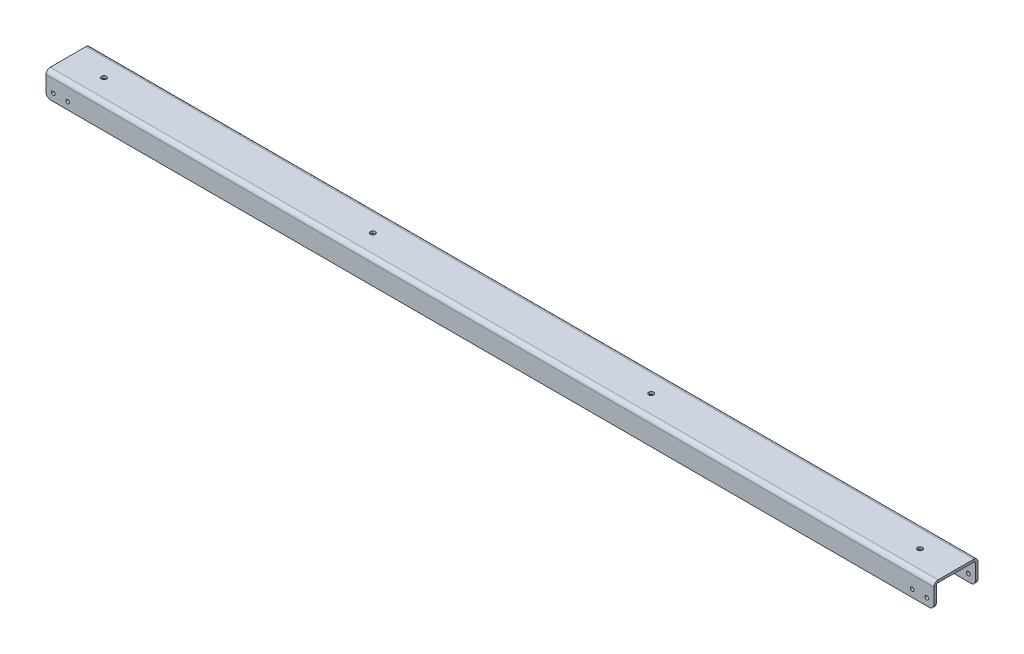
ISO-10303-21;
HEADER;
FILE_DESCRIPTION(('STEP AP214'),'2;1');
FILE_NAME('part.step','',(''),(''),'','','');
FILE_SCHEMA(('AUTOMOTIVE_DESIGN { 1 0 10303 214 1 1 1 1 }'));
ENDSEC;
DATA;
#1=APPLICATION_CONTEXT('core data for automotive mechanical design processes');
#2=APPLICATION_PROTOCOL_DEFINITION('international standard','automotive_design',2000,#1);
#3=PRODUCT_CONTEXT('',#1,'mechanical');
#4=PRODUCT('Part','Part','',(#3));
#5=PRODUCT_RELATED_PRODUCT_CATEGORY('part','',(#4));
#6=PRODUCT_DEFINITION_FORMATION('','',#4);
#7=PRODUCT_DEFINITION_CONTEXT('part definition',#1,'design');
#8=PRODUCT_DEFINITION('design','',#6,#7);
#9=PRODUCT_DEFINITION_SHAPE('','',#8);
#10=(LENGTH_UNIT() NAMED_UNIT(*) SI_UNIT(.MILLI.,.METRE.));
#11=(NAMED_UNIT(*) PLANE_ANGLE_UNIT() SI_UNIT($,.RADIAN.));
#12=(NAMED_UNIT(*) SI_UNIT($,.STERADIAN.) SOLID_ANGLE_UNIT());
#13=UNCERTAINTY_MEASURE_WITH_UNIT(LENGTH_MEASURE(1.E-05),#10,'distance_accuracy_value','');
#14=(GEOMETRIC_REPRESENTATION_CONTEXT(3) GLOBAL_UNCERTAINTY_ASSIGNED_CONTEXT((#13)) GLOBAL_UNIT_ASSIGNED_CONTEXT((#10,
#11,#12)) REPRESENTATION_CONTEXT('',''));
#15=CARTESIAN_POINT('',(0.,0.,0.));
#16=DIRECTION('',(0.,0.,1.));
#17=DIRECTION('',(1.,0.,0.));
#18=AXIS2_PLACEMENT_3D('',#15,#16,#17);
#19=CARTESIAN_POINT('',(0.,1.02619171131884E-13,-29.1719));
#20=DIRECTION('',(0.,0.,-1.));
#21=DIRECTION('',(0.,1.,0.));
#22=AXIS2_PLACEMENT_3D('',#19,#20,#21);
#23=PLANE('',#22);
#24=CARTESIAN_POINT('',(577.85,-22.3138999999999,-29.1719000000001));
#25=DIRECTION('',(0.,0.,1.));
#26=DIRECTION('',(1.,0.,0.));
#27=AXIS2_PLACEMENT_3D('',#24,#25,#26);
#28=CIRCLE('',#27,2.45744999999997);
#29=CARTESIAN_POINT('',(580.30745,-22.3138999999999,-29.1719000000001));
#30=VERTEX_POINT('',#29);
#31=EDGE_CURVE('E289',#30,#30,#28,.T.);
#32=ORIENTED_EDGE('',*,*,#31,.T.);
#33=EDGE_LOOP('',(#32));
#34=FACE_BOUND('',#33,.T.);
#35=CARTESIAN_POINT('',(558.8,-22.3138999999999,-29.1719000000001));
#36=DIRECTION('',(0.,0.,1.));
#37=DIRECTION('',(1.,0.,0.));
#38=AXIS2_PLACEMENT_3D('',#35,#36,#37);
#39=CIRCLE('',#38,2.45744999999997);
#40=CARTESIAN_POINT('',(561.25745,-22.3138999999999,-29.1719000000001));
#41=VERTEX_POINT('',#40);
#42=EDGE_CURVE('E284',#41,#41,#39,.T.);
#43=ORIENTED_EDGE('',*,*,#42,.T.);
#44=EDGE_LOOP('',(#43));
#45=FACE_BOUND('',#44,.T.);
#46=CARTESIAN_POINT('',(-558.8,-22.3138999999999,-29.1719000000001));
#47=DIRECTION('',(0.,0.,1.));
#48=DIRECTION('',(1.,0.,0.));
#49=AXIS2_PLACEMENT_3D('',#46,#47,#48);
#50=CIRCLE('',#49,2.45744999999997);
#51=CARTESIAN_POINT('',(-556.34255,-22.3138999999999,-29.1719000000001));
#52=VERTEX_POINT('',#51);
#53=EDGE_CURVE('E279',#52,#52,#50,.T.);
#54=ORIENTED_EDGE('',*,*,#53,.T.);
#55=EDGE_LOOP('',(#54));
#56=FACE_BOUND('',#55,.T.);
#57=DIRECTION('',(1.,0.,0.));
#58=VECTOR('',#57,1.);
#59=CARTESIAN_POINT('',(587.375,-31.8389,-29.1719000000001));
#60=LINE('',#59,#58);
#61=CARTESIAN_POINT('',(-581.025,-31.8389,-29.1719000000001));
#62=VERTEX_POINT('',#61);
#63=CARTESIAN_POINT('',(581.025,-31.8389,-29.1719000000001));
#64=VERTEX_POINT('',#63);
#65=EDGE_CURVE('E156',#62,#64,#60,.T.);
#66=ORIENTED_EDGE('',*,*,#65,.F.);
#67=CARTESIAN_POINT('',(-581.025,-25.4889,-29.1719000000001));
#68=DIRECTION('',(0.,0.,-1.));
#69=DIRECTION('',(0.,1.,0.));
#70=AXIS2_PLACEMENT_3D('',#67,#68,#69);
#71=CIRCLE('',#70,6.35);
#72=CARTESIAN_POINT('',(-587.375,-25.4888999999999,-29.1719000000001));
#73=VERTEX_POINT('',#72);
#74=EDGE_CURVE('E317',#62,#73,#71,.T.);
#75=ORIENTED_EDGE('',*,*,#74,.T.);
#76=DIRECTION('',(0.,-1.,0.));
#77=VECTOR('',#76,1.);
#78=CARTESIAN_POINT('',(-587.375,-31.8389,-29.1719000000001));
#79=LINE('',#78,#77);
#80=CARTESIAN_POINT('',(-587.375,-5.54989999999997,-29.1719));
#81=VERTEX_POINT('',#80);
#82=EDGE_CURVE('E179',#81,#73,#79,.T.);
#83=ORIENTED_EDGE('',*,*,#82,.F.);
#84=DIRECTION('',(1.,0.,0.));
#85=VECTOR('',#84,1.);
#86=CARTESIAN_POINT('',(0.,-5.54989999999995,-29.1719));
#87=LINE('',#86,#85);
#88=CARTESIAN_POINT('',(587.375,-5.54989999999995,-29.1719));
#89=VERTEX_POINT('',#88);
#90=EDGE_CURVE('E164',#81,#89,#87,.T.);
#91=ORIENTED_EDGE('',*,*,#90,.T.);
#92=DIRECTION('',(0.,1.,0.));
#93=VECTOR('',#92,1.);
#94=CARTESIAN_POINT('',(587.375,-3.26389999999999,-29.1719));
#95=LINE('',#94,#93);
#96=CARTESIAN_POINT('',(587.375,-25.4889,-29.1719000000001));
#97=VERTEX_POINT('',#96);
#98=EDGE_CURVE('E149',#97,#89,#95,.T.);
#99=ORIENTED_EDGE('',*,*,#98,.F.);
#100=CARTESIAN_POINT('',(581.025,-25.4889,-29.1719000000001));
#101=DIRECTION('',(0.,0.,-1.));
#102=DIRECTION('',(0.,1.,0.));
#103=AXIS2_PLACEMENT_3D('',#100,#101,#102);
#104=CIRCLE('',#103,6.35);
#105=EDGE_CURVE('E58',#97,#64,#104,.T.);
#106=ORIENTED_EDGE('',*,*,#105,.T.);
#107=EDGE_LOOP('',(#66,#75,#83,#91,#99,#106));
#108=FACE_BOUND('',#107,.T.);
#109=CARTESIAN_POINT('',(-577.85,-22.3138999999999,-29.1719000000001));
#110=DIRECTION('',(0.,0.,1.));
#111=DIRECTION('',(1.,0.,0.));
#112=AXIS2_PLACEMENT_3D('',#109,#110,#111);
#113=CIRCLE('',#112,2.45744999999997);
#114=CARTESIAN_POINT('',(-575.39255,-22.3138999999999,-29.1719000000001));
#115=VERTEX_POINT('',#114);
#116=EDGE_CURVE('E274',#115,#115,#113,.T.);
#117=ORIENTED_EDGE('',*,*,#116,.T.);
#118=EDGE_LOOP('',(#117));
#119=FACE_BOUND('',#118,.T.);
#120=ADVANCED_FACE('F38',(#34,#45,#56,#108,#119),#23,.T.);
#121=CARTESIAN_POINT('',(0.,-3.2639,0.));
#122=DIRECTION('',(0.,-1.,0.));
#123=DIRECTION('',(0.,0.,-1.));
#124=AXIS2_PLACEMENT_3D('',#121,#122,#123);
#125=PLANE('',#124);
#126=CARTESIAN_POINT('',(539.75,-3.2639,0.));
#127=DIRECTION('',(0.,-1.,0.));
#128=DIRECTION('',(0.,0.,-1.));
#129=AXIS2_PLACEMENT_3D('',#126,#127,#128);
#130=CIRCLE('',#129,3.26389999999999);
#131=CARTESIAN_POINT('',(539.75,-3.2639,-3.26389999999999));
#132=VERTEX_POINT('',#131);
#133=EDGE_CURVE('E724',#132,#132,#130,.T.);
#134=ORIENTED_EDGE('',*,*,#133,.F.);
#135=EDGE_LOOP('',(#134));
#136=FACE_BOUND('',#135,.T.);
#137=CARTESIAN_POINT('',(184.15,-3.2639,0.));
#138=DIRECTION('',(0.,-1.,0.));
#139=DIRECTION('',(0.,0.,-1.));
#140=AXIS2_PLACEMENT_3D('',#137,#138,#139);
#141=CIRCLE('',#140,3.26389999999999);
#142=CARTESIAN_POINT('',(184.15,-3.2639,-3.26389999999999));
#143=VERTEX_POINT('',#142);
#144=EDGE_CURVE('E734',#143,#143,#141,.T.);
#145=ORIENTED_EDGE('',*,*,#144,.F.);
#146=EDGE_LOOP('',(#145));
#147=FACE_BOUND('',#146,.T.);
#148=CARTESIAN_POINT('',(-184.15,-3.2639,0.));
#149=DIRECTION('',(0.,-1.,0.));
#150=DIRECTION('',(0.,0.,-1.));
#151=AXIS2_PLACEMENT_3D('',#148,#149,#150);
#152=CIRCLE('',#151,3.26389999999999);
#153=CARTESIAN_POINT('',(-184.15,-3.2639,-3.26389999999999));
#154=VERTEX_POINT('',#153);
#155=EDGE_CURVE('E740',#154,#154,#152,.T.);
#156=ORIENTED_EDGE('',*,*,#155,.F.);
#157=EDGE_LOOP('',(#156));
#158=FACE_BOUND('',#157,.T.);
#159=CARTESIAN_POINT('',(-539.75,-3.2639,0.));
#160=DIRECTION('',(0.,-1.,0.));
#161=DIRECTION('',(0.,0.,-1.));
#162=AXIS2_PLACEMENT_3D('',#159,#160,#161);
#163=CIRCLE('',#162,3.26389999999999);
#164=CARTESIAN_POINT('',(-539.75,-3.2639,-3.26389999999999));
#165=VERTEX_POINT('',#164);
#166=EDGE_CURVE('E746',#165,#165,#163,.T.);
#167=ORIENTED_EDGE('',*,*,#166,.F.);
#168=EDGE_LOOP('',(#167));
#169=FACE_BOUND('',#168,.T.);
#170=DIRECTION('',(0.,0.,1.));
#171=VECTOR('',#170,1.);
#172=CARTESIAN_POINT('',(-587.375,-3.2639,25.908));
#173=LINE('',#172,#171);
#174=CARTESIAN_POINT('',(-587.375,-3.26389999999999,-23.622));
#175=VERTEX_POINT('',#174);
#176=CARTESIAN_POINT('',(-587.375,-3.2639,23.622));
#177=VERTEX_POINT('',#176);
#178=EDGE_CURVE('E263',#175,#177,#173,.T.);
#179=ORIENTED_EDGE('',*,*,#178,.F.);
#180=DIRECTION('',(1.,0.,0.));
#181=VECTOR('',#180,1.);
#182=CARTESIAN_POINT('',(587.375,-3.26389999999999,-23.622));
#183=LINE('',#182,#181);
#184=CARTESIAN_POINT('',(587.375,-3.26389999999999,-23.622));
#185=VERTEX_POINT('',#184);
#186=EDGE_CURVE('E200',#185,#175,#183,.F.);
#187=ORIENTED_EDGE('',*,*,#186,.F.);
#188=DIRECTION('',(0.,0.,-1.));
#189=VECTOR('',#188,1.);
#190=CARTESIAN_POINT('',(587.375,-3.2639,25.908));
#191=LINE('',#190,#189);
#192=CARTESIAN_POINT('',(587.375,-3.2639,23.622));
#193=VERTEX_POINT('',#192);
#194=EDGE_CURVE('E260',#193,#185,#191,.T.);
#195=ORIENTED_EDGE('',*,*,#194,.F.);
#196=DIRECTION('',(-1.,0.,0.));
#197=VECTOR('',#196,1.);
#198=CARTESIAN_POINT('',(-587.375,-3.26390000000001,23.622));
#199=LINE('',#198,#197);
#200=EDGE_CURVE('E250',#177,#193,#199,.F.);
#201=ORIENTED_EDGE('',*,*,#200,.F.);
#202=EDGE_LOOP('',(#179,#187,#195,#201));
#203=FACE_BOUND('',#202,.T.);
#204=ADVANCED_FACE('F383',(#136,#147,#158,#169,#203),#125,.T.);
#205=CARTESIAN_POINT('',(0.,0.,0.));
#206=DIRECTION('',(0.,-1.,0.));
#207=DIRECTION('',(0.,0.,-1.));
#208=AXIS2_PLACEMENT_3D('',#205,#206,#207);
#209=PLANE('',#208);
#210=CARTESIAN_POINT('',(539.75,0.,0.));
#211=DIRECTION('',(0.,1.,0.));
#212=DIRECTION('',(0.,0.,1.));
#213=AXIS2_PLACEMENT_3D('',#210,#211,#212);
#214=CIRCLE('',#213,3.26389999999999);
#215=CARTESIAN_POINT('',(539.75,0.,3.26389999999999));
#216=VERTEX_POINT('',#215);
#217=EDGE_CURVE('E727',#216,#216,#214,.T.);
#218=ORIENTED_EDGE('',*,*,#217,.F.);
#219=EDGE_LOOP('',(#218));
#220=FACE_BOUND('',#219,.T.);
#221=CARTESIAN_POINT('',(184.15,0.,0.));
#222=DIRECTION('',(0.,1.,0.));
#223=DIRECTION('',(0.,0.,1.));
#224=AXIS2_PLACEMENT_3D('',#221,#222,#223);
#225=CIRCLE('',#224,3.26389999999999);
#226=CARTESIAN_POINT('',(184.15,0.,3.26389999999999));
#227=VERTEX_POINT('',#226);
#228=EDGE_CURVE('E729',#227,#227,#225,.T.);
#229=ORIENTED_EDGE('',*,*,#228,.F.);
#230=EDGE_LOOP('',(#229));
#231=FACE_BOUND('',#230,.T.);
#232=CARTESIAN_POINT('',(-184.15,0.,0.));
#233=DIRECTION('',(0.,1.,0.));
#234=DIRECTION('',(0.,0.,1.));
#235=AXIS2_PLACEMENT_3D('',#232,#233,#234);
#236=CIRCLE('',#235,3.26389999999999);
#237=CARTESIAN_POINT('',(-184.15,0.,3.26389999999999));
#238=VERTEX_POINT('',#237);
#239=EDGE_CURVE('E737',#238,#238,#236,.T.);
#240=ORIENTED_EDGE('',*,*,#239,.F.);
#241=EDGE_LOOP('',(#240));
#242=FACE_BOUND('',#241,.T.);
#243=CARTESIAN_POINT('',(-539.75,0.,0.));
#244=DIRECTION('',(0.,1.,0.));
#245=DIRECTION('',(0.,0.,1.));
#246=AXIS2_PLACEMENT_3D('',#243,#244,#245);
#247=CIRCLE('',#246,3.26389999999999);
#248=CARTESIAN_POINT('',(-539.75,0.,3.26389999999999));
#249=VERTEX_POINT('',#248);
#250=EDGE_CURVE('E743',#249,#249,#247,.T.);
#251=ORIENTED_EDGE('',*,*,#250,.F.);
#252=EDGE_LOOP('',(#251));
#253=FACE_BOUND('',#252,.T.);
#254=DIRECTION('',(1.,0.,0.));
#255=VECTOR('',#254,1.);
#256=CARTESIAN_POINT('',(587.375,0.,-23.622));
#257=LINE('',#256,#255);
#258=CARTESIAN_POINT('',(587.375,0.,-23.622));
#259=VERTEX_POINT('',#258);
#260=CARTESIAN_POINT('',(-587.375,0.,-23.622));
#261=VERTEX_POINT('',#260);
#262=EDGE_CURVE('E166',#259,#261,#257,.F.);
#263=ORIENTED_EDGE('',*,*,#262,.T.);
#264=DIRECTION('',(0.,0.,1.));
#265=VECTOR('',#264,1.);
#266=CARTESIAN_POINT('',(-587.375,0.,25.908));
#267=LINE('',#266,#265);
#268=CARTESIAN_POINT('',(-587.375,0.,23.622));
#269=VERTEX_POINT('',#268);
#270=EDGE_CURVE('E264',#261,#269,#267,.T.);
#271=ORIENTED_EDGE('',*,*,#270,.T.);
#272=DIRECTION('',(-1.,0.,0.));
#273=VECTOR('',#272,1.);
#274=CARTESIAN_POINT('',(-587.375,0.,23.622));
#275=LINE('',#274,#273);
#276=CARTESIAN_POINT('',(587.375,0.,23.622));
#277=VERTEX_POINT('',#276);
#278=EDGE_CURVE('E238',#269,#277,#275,.F.);
#279=ORIENTED_EDGE('',*,*,#278,.T.);
#280=DIRECTION('',(0.,0.,-1.));
#281=VECTOR('',#280,1.);
#282=CARTESIAN_POINT('',(587.375,0.,25.908));
#283=LINE('',#282,#281);
#284=EDGE_CURVE('E258',#277,#259,#283,.T.);
#285=ORIENTED_EDGE('',*,*,#284,.T.);
#286=EDGE_LOOP('',(#263,#271,#279,#285));
#287=FACE_BOUND('',#286,.T.);
#288=ADVANCED_FACE('F352',(#220,#231,#242,#253,#287),#209,.F.);
#289=CARTESIAN_POINT('',(587.375,-3.2639,25.908));
#290=DIRECTION('',(1.,0.,0.));
#291=DIRECTION('',(0.,0.,-1.));
#292=AXIS2_PLACEMENT_3D('',#289,#290,#291);
#293=PLANE('',#292);
#294=ORIENTED_EDGE('',*,*,#194,.T.);
#295=DIRECTION('',(0.,1.,0.));
#296=VECTOR('',#295,1.);
#297=CARTESIAN_POINT('',(587.375,-3.26389999999999,-23.622));
#298=LINE('',#297,#296);
#299=EDGE_CURVE('E196',#185,#259,#298,.T.);
#300=ORIENTED_EDGE('',*,*,#299,.T.);
#301=ORIENTED_EDGE('',*,*,#284,.F.);
#302=DIRECTION('',(0.,1.,0.));
#303=VECTOR('',#302,1.);
#304=CARTESIAN_POINT('',(587.375,-3.26390000000001,23.622));
#305=LINE('',#304,#303);
#306=EDGE_CURVE('E255',#193,#277,#305,.T.);
#307=ORIENTED_EDGE('',*,*,#306,.F.);
#308=EDGE_LOOP('',(#294,#300,#301,#307));
#309=FACE_BOUND('',#308,.T.);
#310=ADVANCED_FACE('F355',(#309),#293,.T.);
#311=CARTESIAN_POINT('',(-587.375,-3.2639,25.908));
#312=DIRECTION('',(-1.,0.,0.));
#313=DIRECTION('',(0.,0.,1.));
#314=AXIS2_PLACEMENT_3D('',#311,#312,#313);
#315=PLANE('',#314);
#316=DIRECTION('',(0.,1.,0.));
#317=VECTOR('',#316,1.);
#318=CARTESIAN_POINT('',(-587.375,-3.26389999999999,-23.622));
#319=LINE('',#318,#317);
#320=EDGE_CURVE('E204',#175,#261,#319,.T.);
#321=ORIENTED_EDGE('',*,*,#320,.F.);
#322=ORIENTED_EDGE('',*,*,#178,.T.);
#323=DIRECTION('',(0.,1.,0.));
#324=VECTOR('',#323,1.);
#325=CARTESIAN_POINT('',(-587.375,-3.26390000000001,23.622));
#326=LINE('',#325,#324);
#327=EDGE_CURVE('E244',#177,#269,#326,.T.);
#328=ORIENTED_EDGE('',*,*,#327,.T.);
#329=ORIENTED_EDGE('',*,*,#270,.F.);
#330=EDGE_LOOP('',(#321,#322,#328,#329));
#331=FACE_BOUND('',#330,.T.);
#332=ADVANCED_FACE('F442',(#331),#315,.T.);
#333=CARTESIAN_POINT('',(587.375,-5.54990000000001,23.622));
#334=DIRECTION('',(1.,0.,0.));
#335=DIRECTION('',(0.,0.,-1.));
#336=AXIS2_PLACEMENT_3D('',#333,#334,#335);
#337=PLANE('',#336);
#338=DIRECTION('',(0.,0.,1.));
#339=VECTOR('',#338,1.);
#340=CARTESIAN_POINT('',(587.375,-5.54989999999999,25.908));
#341=LINE('',#340,#339);
#342=CARTESIAN_POINT('',(587.375,-5.5499,25.908));
#343=VERTEX_POINT('',#342);
#344=CARTESIAN_POINT('',(587.375,-5.54989999999999,29.1719));
#345=VERTEX_POINT('',#344);
#346=EDGE_CURVE('E207',#343,#345,#341,.T.);
#347=ORIENTED_EDGE('',*,*,#346,.F.);
#348=CARTESIAN_POINT('',(587.375,-5.54990000000001,23.622));
#349=DIRECTION('',(-1.,0.,0.));
#350=DIRECTION('',(0.,0.,1.));
#351=AXIS2_PLACEMENT_3D('',#348,#349,#350);
#352=CIRCLE('',#351,2.286);
#353=EDGE_CURVE('E247',#193,#343,#352,.F.);
#354=ORIENTED_EDGE('',*,*,#353,.F.);
#355=ORIENTED_EDGE('',*,*,#306,.T.);
#356=CARTESIAN_POINT('',(587.375,-5.54990000000001,23.622));
#357=DIRECTION('',(-1.,0.,0.));
#358=DIRECTION('',(0.,0.,1.));
#359=AXIS2_PLACEMENT_3D('',#356,#357,#358);
#360=CIRCLE('',#359,5.5499);
#361=EDGE_CURVE('E240',#277,#345,#360,.F.);
#362=ORIENTED_EDGE('',*,*,#361,.T.);
#363=EDGE_LOOP('',(#347,#354,#355,#362));
#364=FACE_BOUND('',#363,.T.);
#365=ADVANCED_FACE('F358',(#364),#337,.T.);
#366=CARTESIAN_POINT('',(-587.375,-5.54990000000001,23.622));
#367=DIRECTION('',(1.,0.,0.));
#368=DIRECTION('',(0.,0.,-1.));
#369=AXIS2_PLACEMENT_3D('',#366,#367,#368);
#370=PLANE('',#369);
#371=CARTESIAN_POINT('',(-587.375,-5.54990000000001,23.622));
#372=DIRECTION('',(-1.,0.,0.));
#373=DIRECTION('',(0.,0.,1.));
#374=AXIS2_PLACEMENT_3D('',#371,#372,#373);
#375=CIRCLE('',#374,2.286);
#376=CARTESIAN_POINT('',(-587.375,-5.5499,25.908));
#377=VERTEX_POINT('',#376);
#378=EDGE_CURVE('E231',#377,#177,#375,.T.);
#379=ORIENTED_EDGE('',*,*,#378,.F.);
#380=DIRECTION('',(0.,0.,1.));
#381=VECTOR('',#380,1.);
#382=CARTESIAN_POINT('',(-587.375,-5.54990000000003,25.908));
#383=LINE('',#382,#381);
#384=CARTESIAN_POINT('',(-587.375,-5.54990000000001,29.1719));
#385=VERTEX_POINT('',#384);
#386=EDGE_CURVE('E213',#377,#385,#383,.T.);
#387=ORIENTED_EDGE('',*,*,#386,.T.);
#388=CARTESIAN_POINT('',(-587.375,-5.54990000000001,23.622));
#389=DIRECTION('',(-1.,0.,0.));
#390=DIRECTION('',(0.,0.,1.));
#391=AXIS2_PLACEMENT_3D('',#388,#389,#390);
#392=CIRCLE('',#391,5.5499);
#393=EDGE_CURVE('E241',#385,#269,#392,.T.);
#394=ORIENTED_EDGE('',*,*,#393,.T.);
#395=ORIENTED_EDGE('',*,*,#327,.F.);
#396=EDGE_LOOP('',(#379,#387,#394,#395));
#397=FACE_BOUND('',#396,.T.);
#398=ADVANCED_FACE('F338',(#397),#370,.F.);
#399=CARTESIAN_POINT('',(-587.375,-5.54990000000001,23.622));
#400=DIRECTION('',(-1.,0.,0.));
#401=DIRECTION('',(0.,0.,1.));
#402=AXIS2_PLACEMENT_3D('',#399,#400,#401);
#403=CYLINDRICAL_SURFACE('',#402,5.5499);
#404=ORIENTED_EDGE('',*,*,#278,.F.);
#405=ORIENTED_EDGE('',*,*,#393,.F.);
#406=DIRECTION('',(-1.,0.,0.));
#407=VECTOR('',#406,1.);
#408=CARTESIAN_POINT('',(0.,-5.54990000000001,29.1719));
#409=LINE('',#408,#407);
#410=EDGE_CURVE('E216',#345,#385,#409,.T.);
#411=ORIENTED_EDGE('',*,*,#410,.F.);
#412=ORIENTED_EDGE('',*,*,#361,.F.);
#413=EDGE_LOOP('',(#404,#405,#411,#412));
#414=FACE_BOUND('',#413,.T.);
#415=ADVANCED_FACE('F348',(#414),#403,.T.);
#416=CARTESIAN_POINT('',(-587.375,-5.54990000000001,23.622));
#417=DIRECTION('',(-1.,0.,0.));
#418=DIRECTION('',(0.,0.,1.));
#419=AXIS2_PLACEMENT_3D('',#416,#417,#418);
#420=CYLINDRICAL_SURFACE('',#419,2.286);
#421=ORIENTED_EDGE('',*,*,#200,.T.);
#422=ORIENTED_EDGE('',*,*,#353,.T.);
#423=DIRECTION('',(-1.,0.,0.));
#424=VECTOR('',#423,1.);
#425=CARTESIAN_POINT('',(587.375,-5.54989999999999,25.908));
#426=LINE('',#425,#424);
#427=EDGE_CURVE('E210',#343,#377,#426,.T.);
#428=ORIENTED_EDGE('',*,*,#427,.T.);
#429=ORIENTED_EDGE('',*,*,#378,.T.);
#430=EDGE_LOOP('',(#421,#422,#428,#429));
#431=FACE_BOUND('',#430,.T.);
#432=ADVANCED_FACE('F333',(#431),#420,.F.);
#433=CARTESIAN_POINT('',(-587.375,-3.26389999999999,29.1719));
#434=DIRECTION('',(-1.,0.,0.));
#435=DIRECTION('',(0.,-1.,0.));
#436=AXIS2_PLACEMENT_3D('',#433,#434,#435);
#437=PLANE('',#436);
#438=DIRECTION('',(0.,1.,0.));
#439=VECTOR('',#438,1.);
#440=CARTESIAN_POINT('',(-587.375,-3.2639,25.908));
#441=LINE('',#440,#439);
#442=CARTESIAN_POINT('',(-587.375,-25.4888999999999,25.9080000000001));
#443=VERTEX_POINT('',#442);
#444=EDGE_CURVE('E226',#443,#377,#441,.T.);
#445=ORIENTED_EDGE('',*,*,#444,.F.);
#446=DIRECTION('',(0.,0.,-1.));
#447=VECTOR('',#446,1.);
#448=CARTESIAN_POINT('',(-587.375,-25.4888999999999,29.1719000000001));
#449=LINE('',#448,#447);
#450=CARTESIAN_POINT('',(-587.375,-25.4888999999999,29.1719000000001));
#451=VERTEX_POINT('',#450);
#452=EDGE_CURVE('E298',#443,#451,#449,.F.);
#453=ORIENTED_EDGE('',*,*,#452,.T.);
#454=DIRECTION('',(0.,1.,0.));
#455=VECTOR('',#454,1.);
#456=CARTESIAN_POINT('',(-587.375,-3.26389999999999,29.1719));
#457=LINE('',#456,#455);
#458=EDGE_CURVE('E229',#451,#385,#457,.T.);
#459=ORIENTED_EDGE('',*,*,#458,.T.);
#460=ORIENTED_EDGE('',*,*,#386,.F.);
#461=EDGE_LOOP('',(#445,#453,#459,#460));
#462=FACE_BOUND('',#461,.T.);
#463=ADVANCED_FACE('F340',(#462),#437,.T.);
#464=CARTESIAN_POINT('',(587.375,-31.8389,29.1719000000001));
#465=DIRECTION('',(1.,0.,0.));
#466=DIRECTION('',(0.,1.,0.));
#467=AXIS2_PLACEMENT_3D('',#464,#465,#466);
#468=PLANE('',#467);
#469=DIRECTION('',(0.,-1.,0.));
#470=VECTOR('',#469,1.);
#471=CARTESIAN_POINT('',(587.375,-31.8389,29.1719000000001));
#472=LINE('',#471,#470);
#473=CARTESIAN_POINT('',(587.375,-25.4889,29.1719000000001));
#474=VERTEX_POINT('',#473);
#475=EDGE_CURVE('E222',#345,#474,#472,.T.);
#476=ORIENTED_EDGE('',*,*,#475,.T.);
#477=DIRECTION('',(0.,0.,-1.));
#478=VECTOR('',#477,1.);
#479=CARTESIAN_POINT('',(587.375,-25.4889,29.1719000000001));
#480=LINE('',#479,#478);
#481=CARTESIAN_POINT('',(587.375,-25.4889000000001,25.9080000000001));
#482=VERTEX_POINT('',#481);
#483=EDGE_CURVE('E46',#474,#482,#480,.T.);
#484=ORIENTED_EDGE('',*,*,#483,.T.);
#485=DIRECTION('',(0.,-1.,0.));
#486=VECTOR('',#485,1.);
#487=CARTESIAN_POINT('',(587.375,-31.8389,25.9080000000001));
#488=LINE('',#487,#486);
#489=EDGE_CURVE('E221',#343,#482,#488,.T.);
#490=ORIENTED_EDGE('',*,*,#489,.F.);
#491=ORIENTED_EDGE('',*,*,#346,.T.);
#492=EDGE_LOOP('',(#476,#484,#490,#491));
#493=FACE_BOUND('',#492,.T.);
#494=ADVANCED_FACE('F322',(#493),#468,.T.);
#495=CARTESIAN_POINT('',(0.,1.02619171131884E-13,29.1719));
#496=DIRECTION('',(0.,0.,1.));
#497=DIRECTION('',(0.,-1.,0.));
#498=AXIS2_PLACEMENT_3D('',#495,#496,#497);
#499=PLANE('',#498);
#500=CARTESIAN_POINT('',(577.85,-22.3138999999999,29.1719));
#501=DIRECTION('',(0.,0.,1.));
#502=DIRECTION('',(1.,0.,0.));
#503=AXIS2_PLACEMENT_3D('',#500,#501,#502);
#504=CIRCLE('',#503,2.45744999999997);
#505=CARTESIAN_POINT('',(580.30745,-22.3138999999999,29.1719));
#506=VERTEX_POINT('',#505);
#507=EDGE_CURVE('E749',#506,#506,#504,.T.);
#508=ORIENTED_EDGE('',*,*,#507,.F.);
#509=EDGE_LOOP('',(#508));
#510=FACE_BOUND('',#509,.T.);
#511=CARTESIAN_POINT('',(558.8,-22.3138999999999,29.1719));
#512=DIRECTION('',(0.,0.,1.));
#513=DIRECTION('',(1.,0.,0.));
#514=AXIS2_PLACEMENT_3D('',#511,#512,#513);
#515=CIRCLE('',#514,2.45744999999997);
#516=CARTESIAN_POINT('',(561.25745,-22.3138999999999,29.1719));
#517=VERTEX_POINT('',#516);
#518=EDGE_CURVE('E755',#517,#517,#515,.T.);
#519=ORIENTED_EDGE('',*,*,#518,.F.);
#520=EDGE_LOOP('',(#519));
#521=FACE_BOUND('',#520,.T.);
#522=CARTESIAN_POINT('',(-558.8,-22.3138999999999,29.1719));
#523=DIRECTION('',(0.,0.,1.));
#524=DIRECTION('',(1.,0.,0.));
#525=AXIS2_PLACEMENT_3D('',#522,#523,#524);
#526=CIRCLE('',#525,2.45744999999997);
#527=CARTESIAN_POINT('',(-556.34255,-22.3138999999999,29.1719));
#528=VERTEX_POINT('',#527);
#529=EDGE_CURVE('E762',#528,#528,#526,.T.);
#530=ORIENTED_EDGE('',*,*,#529,.F.);
#531=EDGE_LOOP('',(#530));
#532=FACE_BOUND('',#531,.T.);
#533=CARTESIAN_POINT('',(-577.85,-22.3138999999999,29.1719));
#534=DIRECTION('',(0.,0.,1.));
#535=DIRECTION('',(1.,0.,0.));
#536=AXIS2_PLACEMENT_3D('',#533,#534,#535);
#537=CIRCLE('',#536,2.45744999999997);
#538=CARTESIAN_POINT('',(-575.39255,-22.3138999999999,29.1719));
#539=VERTEX_POINT('',#538);
#540=EDGE_CURVE('E769',#539,#539,#537,.T.);
#541=ORIENTED_EDGE('',*,*,#540,.F.);
#542=EDGE_LOOP('',(#541));
#543=FACE_BOUND('',#542,.T.);
#544=ORIENTED_EDGE('',*,*,#458,.F.);
#545=CARTESIAN_POINT('',(-581.025,-25.4889,29.1719000000001));
#546=DIRECTION('',(0.,0.,1.));
#547=DIRECTION('',(0.,-1.,0.));
#548=AXIS2_PLACEMENT_3D('',#545,#546,#547);
#549=CIRCLE('',#548,6.35);
#550=CARTESIAN_POINT('',(-581.025,-31.8389,29.1719000000001));
#551=VERTEX_POINT('',#550);
#552=EDGE_CURVE('E302',#451,#551,#549,.T.);
#553=ORIENTED_EDGE('',*,*,#552,.T.);
#554=DIRECTION('',(-1.,0.,0.));
#555=VECTOR('',#554,1.);
#556=CARTESIAN_POINT('',(-587.375,-31.8389,29.1719000000001));
#557=LINE('',#556,#555);
#558=CARTESIAN_POINT('',(581.025,-31.8389,29.1719000000001));
#559=VERTEX_POINT('',#558);
#560=EDGE_CURVE('E225',#559,#551,#557,.T.);
#561=ORIENTED_EDGE('',*,*,#560,.F.);
#562=CARTESIAN_POINT('',(581.025,-25.4889,29.1719000000001));
#563=DIRECTION('',(0.,0.,1.));
#564=DIRECTION('',(0.,-1.,0.));
#565=AXIS2_PLACEMENT_3D('',#562,#563,#564);
#566=CIRCLE('',#565,6.35);
#567=EDGE_CURVE('E300',#559,#474,#566,.T.);
#568=ORIENTED_EDGE('',*,*,#567,.T.);
#569=ORIENTED_EDGE('',*,*,#475,.F.);
#570=ORIENTED_EDGE('',*,*,#410,.T.);
#571=EDGE_LOOP('',(#544,#553,#561,#568,#569,#570));
#572=FACE_BOUND('',#571,.T.);
#573=ADVANCED_FACE('F359',(#510,#521,#532,#543,#572),#499,.T.);
#574=CARTESIAN_POINT('',(0.,0.,25.908));
#575=DIRECTION('',(0.,0.,1.));
#576=DIRECTION('',(0.,-1.,0.));
#577=AXIS2_PLACEMENT_3D('',#574,#575,#576);
#578=PLANE('',#577);
#579=CARTESIAN_POINT('',(577.85,-22.3138999999999,25.9080000000001));
#580=DIRECTION('',(0.,0.,1.));
#581=DIRECTION('',(0.,-1.,0.));
#582=AXIS2_PLACEMENT_3D('',#579,#580,#581);
#583=CIRCLE('',#582,2.45744999999997);
#584=CARTESIAN_POINT('',(577.85,-24.7713499999999,25.9080000000001));
#585=VERTEX_POINT('',#584);
#586=EDGE_CURVE('E288',#585,#585,#583,.T.);
#587=ORIENTED_EDGE('',*,*,#586,.T.);
#588=EDGE_LOOP('',(#587));
#589=FACE_BOUND('',#588,.T.);
#590=CARTESIAN_POINT('',(558.8,-22.3138999999999,25.9080000000001));
#591=DIRECTION('',(0.,0.,1.));
#592=DIRECTION('',(0.,-1.,0.));
#593=AXIS2_PLACEMENT_3D('',#590,#591,#592);
#594=CIRCLE('',#593,2.45744999999997);
#595=CARTESIAN_POINT('',(558.8,-24.7713499999999,25.9080000000001));
#596=VERTEX_POINT('',#595);
#597=EDGE_CURVE('E280',#596,#596,#594,.T.);
#598=ORIENTED_EDGE('',*,*,#597,.T.);
#599=EDGE_LOOP('',(#598));
#600=FACE_BOUND('',#599,.T.);
#601=CARTESIAN_POINT('',(-558.8,-22.3138999999999,25.9080000000001));
#602=DIRECTION('',(0.,0.,1.));
#603=DIRECTION('',(0.,-1.,0.));
#604=AXIS2_PLACEMENT_3D('',#601,#602,#603);
#605=CIRCLE('',#604,2.45744999999997);
#606=CARTESIAN_POINT('',(-558.8,-24.7713499999999,25.9080000000001));
#607=VERTEX_POINT('',#606);
#608=EDGE_CURVE('E275',#607,#607,#605,.T.);
#609=ORIENTED_EDGE('',*,*,#608,.T.);
#610=EDGE_LOOP('',(#609));
#611=FACE_BOUND('',#610,.T.);
#612=CARTESIAN_POINT('',(-577.85,-22.3138999999999,25.9080000000001));
#613=DIRECTION('',(0.,0.,1.));
#614=DIRECTION('',(0.,-1.,0.));
#615=AXIS2_PLACEMENT_3D('',#612,#613,#614);
#616=CIRCLE('',#615,2.45744999999997);
#617=CARTESIAN_POINT('',(-577.85,-24.7713499999999,25.9080000000001));
#618=VERTEX_POINT('',#617);
#619=EDGE_CURVE('E273',#618,#618,#616,.T.);
#620=ORIENTED_EDGE('',*,*,#619,.T.);
#621=EDGE_LOOP('',(#620));
#622=FACE_BOUND('',#621,.T.);
#623=DIRECTION('',(-1.,0.,0.));
#624=VECTOR('',#623,1.);
#625=CARTESIAN_POINT('',(-587.375,-31.8389,25.9080000000001));
#626=LINE('',#625,#624);
#627=CARTESIAN_POINT('',(581.025,-31.8389,25.9080000000001));
#628=VERTEX_POINT('',#627);
#629=CARTESIAN_POINT('',(-581.025,-31.8389,25.9080000000001));
#630=VERTEX_POINT('',#629);
#631=EDGE_CURVE('E234',#628,#630,#626,.T.);
#632=ORIENTED_EDGE('',*,*,#631,.T.);
#633=CARTESIAN_POINT('',(-581.025,-25.4889,25.9080000000001));
#634=DIRECTION('',(0.,0.,1.));
#635=DIRECTION('',(0.,-1.,0.));
#636=AXIS2_PLACEMENT_3D('',#633,#634,#635);
#637=CIRCLE('',#636,6.35);
#638=EDGE_CURVE('E296',#630,#443,#637,.F.);
#639=ORIENTED_EDGE('',*,*,#638,.T.);
#640=ORIENTED_EDGE('',*,*,#444,.T.);
#641=ORIENTED_EDGE('',*,*,#427,.F.);
#642=ORIENTED_EDGE('',*,*,#489,.T.);
#643=CARTESIAN_POINT('',(581.025,-25.4889,25.9080000000001));
#644=DIRECTION('',(0.,0.,1.));
#645=DIRECTION('',(0.,-1.,0.));
#646=AXIS2_PLACEMENT_3D('',#643,#644,#645);
#647=CIRCLE('',#646,6.35);
#648=EDGE_CURVE('E294',#482,#628,#647,.F.);
#649=ORIENTED_EDGE('',*,*,#648,.T.);
#650=EDGE_LOOP('',(#632,#639,#640,#641,#642,#649));
#651=FACE_BOUND('',#650,.T.);
#652=ADVANCED_FACE('F328',(#589,#600,#611,#622,#651),#578,.F.);
#653=CARTESIAN_POINT('',(-587.375,-31.8389,29.1719000000001));
#654=DIRECTION('',(0.,-1.,0.));
#655=DIRECTION('',(0.,0.,-1.));
#656=AXIS2_PLACEMENT_3D('',#653,#654,#655);
#657=PLANE('',#656);
#658=ORIENTED_EDGE('',*,*,#560,.T.);
#659=DIRECTION('',(0.,0.,-1.));
#660=VECTOR('',#659,1.);
#661=CARTESIAN_POINT('',(-581.025,-31.8389,29.1719000000001));
#662=LINE('',#661,#660);
#663=EDGE_CURVE('E291',#551,#630,#662,.T.);
#664=ORIENTED_EDGE('',*,*,#663,.T.);
#665=ORIENTED_EDGE('',*,*,#631,.F.);
#666=DIRECTION('',(0.,0.,-1.));
#667=VECTOR('',#666,1.);
#668=CARTESIAN_POINT('',(581.025,-31.8389,29.1719000000001));
#669=LINE('',#668,#667);
#670=EDGE_CURVE('E266',#628,#559,#669,.F.);
#671=ORIENTED_EDGE('',*,*,#670,.T.);
#672=EDGE_LOOP('',(#658,#664,#665,#671));
#673=FACE_BOUND('',#672,.T.);
#674=ADVANCED_FACE('F364',(#673),#657,.T.);
#675=CARTESIAN_POINT('',(-587.375,-5.54989999999999,-23.622));
#676=DIRECTION('',(-1.,0.,0.));
#677=DIRECTION('',(0.,0.,1.));
#678=AXIS2_PLACEMENT_3D('',#675,#676,#677);
#679=PLANE('',#678);
#680=DIRECTION('',(0.,0.,-1.));
#681=VECTOR('',#680,1.);
#682=CARTESIAN_POINT('',(-587.375,-5.54989999999999,-25.908));
#683=LINE('',#682,#681);
#684=CARTESIAN_POINT('',(-587.375,-5.54989999999998,-25.908));
#685=VERTEX_POINT('',#684);
#686=EDGE_CURVE('E187',#685,#81,#683,.T.);
#687=ORIENTED_EDGE('',*,*,#686,.F.);
#688=CARTESIAN_POINT('',(-587.375,-5.54989999999999,-23.622));
#689=DIRECTION('',(1.,0.,0.));
#690=DIRECTION('',(0.,0.,-1.));
#691=AXIS2_PLACEMENT_3D('',#688,#689,#690);
#692=CIRCLE('',#691,2.286);
#693=EDGE_CURVE('E169',#175,#685,#692,.F.);
#694=ORIENTED_EDGE('',*,*,#693,.F.);
#695=ORIENTED_EDGE('',*,*,#320,.T.);
#696=CARTESIAN_POINT('',(-587.375,-5.54989999999999,-23.622));
#697=DIRECTION('',(1.,0.,0.));
#698=DIRECTION('',(0.,0.,-1.));
#699=AXIS2_PLACEMENT_3D('',#696,#697,#698);
#700=CIRCLE('',#699,5.5499);
#701=EDGE_CURVE('E195',#261,#81,#700,.F.);
#702=ORIENTED_EDGE('',*,*,#701,.T.);
#703=EDGE_LOOP('',(#687,#694,#695,#702));
#704=FACE_BOUND('',#703,.T.);
#705=ADVANCED_FACE('F418',(#704),#679,.T.);
#706=CARTESIAN_POINT('',(587.375,-5.54989999999999,-23.622));
#707=DIRECTION('',(-1.,0.,0.));
#708=DIRECTION('',(0.,0.,1.));
#709=AXIS2_PLACEMENT_3D('',#706,#707,#708);
#710=PLANE('',#709);
#711=CARTESIAN_POINT('',(587.375,-5.54989999999999,-23.622));
#712=DIRECTION('',(1.,0.,0.));
#713=DIRECTION('',(0.,0.,-1.));
#714=AXIS2_PLACEMENT_3D('',#711,#712,#713);
#715=CIRCLE('',#714,2.286);
#716=CARTESIAN_POINT('',(587.375,-5.54989999999998,-25.908));
#717=VERTEX_POINT('',#716);
#718=EDGE_CURVE('E155',#717,#185,#715,.T.);
#719=ORIENTED_EDGE('',*,*,#718,.F.);
#720=DIRECTION('',(0.,0.,-1.));
#721=VECTOR('',#720,1.);
#722=CARTESIAN_POINT('',(587.375,-5.54989999999996,-25.908));
#723=LINE('',#722,#721);
#724=EDGE_CURVE('E153',#717,#89,#723,.T.);
#725=ORIENTED_EDGE('',*,*,#724,.T.);
#726=CARTESIAN_POINT('',(587.375,-5.54989999999999,-23.622));
#727=DIRECTION('',(1.,0.,0.));
#728=DIRECTION('',(0.,0.,-1.));
#729=AXIS2_PLACEMENT_3D('',#726,#727,#728);
#730=CIRCLE('',#729,5.5499);
#731=EDGE_CURVE('E161',#89,#259,#730,.T.);
#732=ORIENTED_EDGE('',*,*,#731,.T.);
#733=ORIENTED_EDGE('',*,*,#299,.F.);
#734=EDGE_LOOP('',(#719,#725,#732,#733));
#735=FACE_BOUND('',#734,.T.);
#736=ADVANCED_FACE('F172',(#735),#710,.F.);
#737=CARTESIAN_POINT('',(587.375,-5.54989999999999,-23.622));
#738=DIRECTION('',(1.,0.,0.));
#739=DIRECTION('',(0.,0.,-1.));
#740=AXIS2_PLACEMENT_3D('',#737,#738,#739);
#741=CYLINDRICAL_SURFACE('',#740,5.5499);
#742=ORIENTED_EDGE('',*,*,#262,.F.);
#743=ORIENTED_EDGE('',*,*,#731,.F.);
#744=ORIENTED_EDGE('',*,*,#90,.F.);
#745=ORIENTED_EDGE('',*,*,#701,.F.);
#746=EDGE_LOOP('',(#742,#743,#744,#745));
#747=FACE_BOUND('',#746,.T.);
#748=ADVANCED_FACE('F162',(#747),#741,.T.);
#749=CARTESIAN_POINT('',(587.375,-5.54989999999999,-23.622));
#750=DIRECTION('',(1.,0.,0.));
#751=DIRECTION('',(0.,0.,-1.));
#752=AXIS2_PLACEMENT_3D('',#749,#750,#751);
#753=CYLINDRICAL_SURFACE('',#752,2.286);
#754=ORIENTED_EDGE('',*,*,#186,.T.);
#755=ORIENTED_EDGE('',*,*,#693,.T.);
#756=DIRECTION('',(1.,0.,0.));
#757=VECTOR('',#756,1.);
#758=CARTESIAN_POINT('',(-587.375,-5.54989999999999,-25.908));
#759=LINE('',#758,#757);
#760=EDGE_CURVE('E174',#685,#717,#759,.T.);
#761=ORIENTED_EDGE('',*,*,#760,.T.);
#762=ORIENTED_EDGE('',*,*,#718,.T.);
#763=EDGE_LOOP('',(#754,#755,#761,#762));
#764=FACE_BOUND('',#763,.T.);
#765=ADVANCED_FACE('F405',(#764),#753,.F.);
#766=CARTESIAN_POINT('',(587.375,-3.26389999999999,-29.1719));
#767=DIRECTION('',(1.,0.,0.));
#768=DIRECTION('',(0.,1.,0.));
#769=AXIS2_PLACEMENT_3D('',#766,#767,#768);
#770=PLANE('',#769);
#771=DIRECTION('',(0.,1.,0.));
#772=VECTOR('',#771,1.);
#773=CARTESIAN_POINT('',(587.375,-3.2639,-25.908));
#774=LINE('',#773,#772);
#775=CARTESIAN_POINT('',(587.375,-25.4889,-25.9080000000001));
#776=VERTEX_POINT('',#775);
#777=EDGE_CURVE('E189',#776,#717,#774,.T.);
#778=ORIENTED_EDGE('',*,*,#777,.F.);
#779=DIRECTION('',(0.,0.,1.));
#780=VECTOR('',#779,1.);
#781=CARTESIAN_POINT('',(587.375,-25.4889,-29.1719000000001));
#782=LINE('',#781,#780);
#783=EDGE_CURVE('E11',#776,#97,#782,.F.);
#784=ORIENTED_EDGE('',*,*,#783,.T.);
#785=ORIENTED_EDGE('',*,*,#98,.T.);
#786=ORIENTED_EDGE('',*,*,#724,.F.);
#787=EDGE_LOOP('',(#778,#784,#785,#786));
#788=FACE_BOUND('',#787,.T.);
#789=ADVANCED_FACE('F151',(#788),#770,.T.);
#790=CARTESIAN_POINT('',(-587.375,-31.8389,-29.1719000000001));
#791=DIRECTION('',(-1.,0.,0.));
#792=DIRECTION('',(0.,-1.,0.));
#793=AXIS2_PLACEMENT_3D('',#790,#791,#792);
#794=PLANE('',#793);
#795=ORIENTED_EDGE('',*,*,#82,.T.);
#796=DIRECTION('',(0.,0.,1.));
#797=VECTOR('',#796,1.);
#798=CARTESIAN_POINT('',(-587.375,-25.4888999999999,-29.1719000000001));
#799=LINE('',#798,#797);
#800=CARTESIAN_POINT('',(-587.375,-25.4889,-25.9080000000001));
#801=VERTEX_POINT('',#800);
#802=EDGE_CURVE('E304',#73,#801,#799,.T.);
#803=ORIENTED_EDGE('',*,*,#802,.T.);
#804=DIRECTION('',(0.,-1.,0.));
#805=VECTOR('',#804,1.);
#806=CARTESIAN_POINT('',(-587.375,-31.8389,-25.9080000000001));
#807=LINE('',#806,#805);
#808=EDGE_CURVE('E180',#685,#801,#807,.T.);
#809=ORIENTED_EDGE('',*,*,#808,.F.);
#810=ORIENTED_EDGE('',*,*,#686,.T.);
#811=EDGE_LOOP('',(#795,#803,#809,#810));
#812=FACE_BOUND('',#811,.T.);
#813=ADVANCED_FACE('F401',(#812),#794,.T.);
#814=CARTESIAN_POINT('',(0.,0.,-25.908));
#815=DIRECTION('',(0.,0.,-1.));
#816=DIRECTION('',(0.,1.,0.));
#817=AXIS2_PLACEMENT_3D('',#814,#815,#816);
#818=PLANE('',#817);
#819=CARTESIAN_POINT('',(577.85,-22.3138999999999,-25.9080000000001));
#820=DIRECTION('',(0.,0.,-1.));
#821=DIRECTION('',(0.,1.,0.));
#822=AXIS2_PLACEMENT_3D('',#819,#820,#821);
#823=CIRCLE('',#822,2.45744999999997);
#824=CARTESIAN_POINT('',(577.85,-19.8564499999999,-25.9080000000001));
#825=VERTEX_POINT('',#824);
#826=EDGE_CURVE('E285',#825,#825,#823,.T.);
#827=ORIENTED_EDGE('',*,*,#826,.T.);
#828=EDGE_LOOP('',(#827));
#829=FACE_BOUND('',#828,.T.);
#830=CARTESIAN_POINT('',(558.8,-22.3138999999999,-25.9080000000001));
#831=DIRECTION('',(0.,0.,-1.));
#832=DIRECTION('',(0.,1.,0.));
#833=AXIS2_PLACEMENT_3D('',#830,#831,#832);
#834=CIRCLE('',#833,2.45744999999997);
#835=CARTESIAN_POINT('',(558.8,-19.8564499999999,-25.9080000000001));
#836=VERTEX_POINT('',#835);
#837=EDGE_CURVE('E283',#836,#836,#834,.T.);
#838=ORIENTED_EDGE('',*,*,#837,.T.);
#839=EDGE_LOOP('',(#838));
#840=FACE_BOUND('',#839,.T.);
#841=CARTESIAN_POINT('',(-558.8,-22.3138999999999,-25.9080000000001));
#842=DIRECTION('',(0.,0.,-1.));
#843=DIRECTION('',(0.,1.,0.));
#844=AXIS2_PLACEMENT_3D('',#841,#842,#843);
#845=CIRCLE('',#844,2.45744999999997);
#846=CARTESIAN_POINT('',(-558.8,-19.8564499999999,-25.9080000000001));
#847=VERTEX_POINT('',#846);
#848=EDGE_CURVE('E278',#847,#847,#845,.T.);
#849=ORIENTED_EDGE('',*,*,#848,.T.);
#850=EDGE_LOOP('',(#849));
#851=FACE_BOUND('',#850,.T.);
#852=CARTESIAN_POINT('',(-577.85,-22.3138999999999,-25.9080000000001));
#853=DIRECTION('',(0.,0.,-1.));
#854=DIRECTION('',(0.,1.,0.));
#855=AXIS2_PLACEMENT_3D('',#852,#853,#854);
#856=CIRCLE('',#855,2.45744999999997);
#857=CARTESIAN_POINT('',(-577.85,-19.8564499999999,-25.9080000000001));
#858=VERTEX_POINT('',#857);
#859=EDGE_CURVE('E270',#858,#858,#856,.T.);
#860=ORIENTED_EDGE('',*,*,#859,.T.);
#861=EDGE_LOOP('',(#860));
#862=FACE_BOUND('',#861,.T.);
#863=ORIENTED_EDGE('',*,*,#808,.T.);
#864=CARTESIAN_POINT('',(-581.025,-25.4889,-25.9080000000001));
#865=DIRECTION('',(0.,0.,-1.));
#866=DIRECTION('',(0.,1.,0.));
#867=AXIS2_PLACEMENT_3D('',#864,#865,#866);
#868=CIRCLE('',#867,6.35);
#869=CARTESIAN_POINT('',(-581.025,-31.8389,-25.9080000000001));
#870=VERTEX_POINT('',#869);
#871=EDGE_CURVE('E309',#801,#870,#868,.F.);
#872=ORIENTED_EDGE('',*,*,#871,.T.);
#873=DIRECTION('',(1.,0.,0.));
#874=VECTOR('',#873,1.);
#875=CARTESIAN_POINT('',(587.375,-31.8389,-25.9080000000001));
#876=LINE('',#875,#874);
#877=CARTESIAN_POINT('',(581.025,-31.8389,-25.9080000000001));
#878=VERTEX_POINT('',#877);
#879=EDGE_CURVE('E183',#870,#878,#876,.T.);
#880=ORIENTED_EDGE('',*,*,#879,.T.);
#881=CARTESIAN_POINT('',(581.025,-25.4889,-25.9080000000001));
#882=DIRECTION('',(0.,0.,-1.));
#883=DIRECTION('',(0.,1.,0.));
#884=AXIS2_PLACEMENT_3D('',#881,#882,#883);
#885=CIRCLE('',#884,6.35);
#886=EDGE_CURVE('E307',#878,#776,#885,.F.);
#887=ORIENTED_EDGE('',*,*,#886,.T.);
#888=ORIENTED_EDGE('',*,*,#777,.T.);
#889=ORIENTED_EDGE('',*,*,#760,.F.);
#890=EDGE_LOOP('',(#863,#872,#880,#887,#888,#889));
#891=FACE_BOUND('',#890,.T.);
#892=ADVANCED_FACE('F397',(#829,#840,#851,#862,#891),#818,.F.);
#893=CARTESIAN_POINT('',(587.375,-31.8389,-29.1719000000001));
#894=DIRECTION('',(0.,-1.,0.));
#895=DIRECTION('',(0.,0.,-1.));
#896=AXIS2_PLACEMENT_3D('',#893,#894,#895);
#897=PLANE('',#896);
#898=ORIENTED_EDGE('',*,*,#879,.F.);
#899=DIRECTION('',(0.,0.,1.));
#900=VECTOR('',#899,1.);
#901=CARTESIAN_POINT('',(-581.025,-31.8389,-29.1719000000001));
#902=LINE('',#901,#900);
#903=EDGE_CURVE('E314',#870,#62,#902,.F.);
#904=ORIENTED_EDGE('',*,*,#903,.T.);
#905=ORIENTED_EDGE('',*,*,#65,.T.);
#906=DIRECTION('',(0.,0.,1.));
#907=VECTOR('',#906,1.);
#908=CARTESIAN_POINT('',(581.025,-31.8389,-29.1719000000001));
#909=LINE('',#908,#907);
#910=EDGE_CURVE('E311',#64,#878,#909,.T.);
#911=ORIENTED_EDGE('',*,*,#910,.T.);
#912=EDGE_LOOP('',(#898,#904,#905,#911));
#913=FACE_BOUND('',#912,.T.);
#914=ADVANCED_FACE('F400',(#913),#897,.T.);
#915=CARTESIAN_POINT('',(-577.85,-22.3138999999999,29.1719));
#916=DIRECTION('',(0.,0.,1.));
#917=DIRECTION('',(1.,0.,0.));
#918=AXIS2_PLACEMENT_3D('',#915,#916,#917);
#919=CYLINDRICAL_SURFACE('',#918,2.45744999999997);
#920=ORIENTED_EDGE('',*,*,#116,.F.);
#921=EDGE_LOOP('',(#920));
#922=FACE_BOUND('',#921,.T.);
#923=ORIENTED_EDGE('',*,*,#859,.F.);
#924=EDGE_LOOP('',(#923));
#925=FACE_BOUND('',#924,.T.);
#926=ADVANCED_FACE('F408',(#922,#925),#919,.F.);
#927=ORIENTED_EDGE('',*,*,#540,.T.);
#928=EDGE_LOOP('',(#927));
#929=FACE_BOUND('',#928,.T.);
#930=ORIENTED_EDGE('',*,*,#619,.F.);
#931=EDGE_LOOP('',(#930));
#932=FACE_BOUND('',#931,.T.);
#933=ADVANCED_FACE('F395',(#929,#932),#919,.F.);
#934=CARTESIAN_POINT('',(-558.8,-22.3138999999999,29.1719));
#935=DIRECTION('',(0.,0.,1.));
#936=DIRECTION('',(1.,0.,0.));
#937=AXIS2_PLACEMENT_3D('',#934,#935,#936);
#938=CYLINDRICAL_SURFACE('',#937,2.45744999999997);
#939=ORIENTED_EDGE('',*,*,#529,.T.);
#940=EDGE_LOOP('',(#939));
#941=FACE_BOUND('',#940,.T.);
#942=ORIENTED_EDGE('',*,*,#608,.F.);
#943=EDGE_LOOP('',(#942));
#944=FACE_BOUND('',#943,.T.);
#945=ADVANCED_FACE('F539',(#941,#944),#938,.F.);
#946=ORIENTED_EDGE('',*,*,#53,.F.);
#947=EDGE_LOOP('',(#946));
#948=FACE_BOUND('',#947,.T.);
#949=ORIENTED_EDGE('',*,*,#848,.F.);
#950=EDGE_LOOP('',(#949));
#951=FACE_BOUND('',#950,.T.);
#952=ADVANCED_FACE('F546',(#948,#951),#938,.F.);
#953=CARTESIAN_POINT('',(558.8,-22.3138999999999,29.1719));
#954=DIRECTION('',(0.,0.,1.));
#955=DIRECTION('',(1.,0.,0.));
#956=AXIS2_PLACEMENT_3D('',#953,#954,#955);
#957=CYLINDRICAL_SURFACE('',#956,2.45744999999997);
#958=ORIENTED_EDGE('',*,*,#518,.T.);
#959=EDGE_LOOP('',(#958));
#960=FACE_BOUND('',#959,.T.);
#961=ORIENTED_EDGE('',*,*,#597,.F.);
#962=EDGE_LOOP('',(#961));
#963=FACE_BOUND('',#962,.T.);
#964=ADVANCED_FACE('F553',(#960,#963),#957,.F.);
#965=ORIENTED_EDGE('',*,*,#42,.F.);
#966=EDGE_LOOP('',(#965));
#967=FACE_BOUND('',#966,.T.);
#968=ORIENTED_EDGE('',*,*,#837,.F.);
#969=EDGE_LOOP('',(#968));
#970=FACE_BOUND('',#969,.T.);
#971=ADVANCED_FACE('F560',(#967,#970),#957,.F.);
#972=CARTESIAN_POINT('',(577.85,-22.3138999999999,29.1719));
#973=DIRECTION('',(0.,0.,1.));
#974=DIRECTION('',(1.,0.,0.));
#975=AXIS2_PLACEMENT_3D('',#972,#973,#974);
#976=CYLINDRICAL_SURFACE('',#975,2.45744999999997);
#977=ORIENTED_EDGE('',*,*,#31,.F.);
#978=EDGE_LOOP('',(#977));
#979=FACE_BOUND('',#978,.T.);
#980=ORIENTED_EDGE('',*,*,#826,.F.);
#981=EDGE_LOOP('',(#980));
#982=FACE_BOUND('',#981,.T.);
#983=ADVANCED_FACE('F378',(#979,#982),#976,.F.);
#984=ORIENTED_EDGE('',*,*,#507,.T.);
#985=EDGE_LOOP('',(#984));
#986=FACE_BOUND('',#985,.T.);
#987=ORIENTED_EDGE('',*,*,#586,.F.);
#988=EDGE_LOOP('',(#987));
#989=FACE_BOUND('',#988,.T.);
#990=ADVANCED_FACE('F370',(#986,#989),#976,.F.);
#991=CARTESIAN_POINT('',(-581.025,-25.4889,29.1719000000001));
#992=DIRECTION('',(0.,0.,-1.));
#993=DIRECTION('',(0.,1.,0.));
#994=AXIS2_PLACEMENT_3D('',#991,#992,#993);
#995=CYLINDRICAL_SURFACE('',#994,6.35);
#996=ORIENTED_EDGE('',*,*,#552,.F.);
#997=ORIENTED_EDGE('',*,*,#452,.F.);
#998=ORIENTED_EDGE('',*,*,#638,.F.);
#999=ORIENTED_EDGE('',*,*,#663,.F.);
#1000=EDGE_LOOP('',(#996,#997,#998,#999));
#1001=FACE_BOUND('',#1000,.T.);
#1002=ADVANCED_FACE('F367',(#1001),#995,.T.);
#1003=CARTESIAN_POINT('',(-581.025,-25.4889,-29.1719000000001));
#1004=DIRECTION('',(0.,0.,1.));
#1005=DIRECTION('',(0.,-1.,0.));
#1006=AXIS2_PLACEMENT_3D('',#1003,#1004,#1005);
#1007=CYLINDRICAL_SURFACE('',#1006,6.35);
#1008=ORIENTED_EDGE('',*,*,#74,.F.);
#1009=ORIENTED_EDGE('',*,*,#903,.F.);
#1010=ORIENTED_EDGE('',*,*,#871,.F.);
#1011=ORIENTED_EDGE('',*,*,#802,.F.);
#1012=EDGE_LOOP('',(#1008,#1009,#1010,#1011));
#1013=FACE_BOUND('',#1012,.T.);
#1014=ADVANCED_FACE('F369',(#1013),#1007,.T.);
#1015=CARTESIAN_POINT('',(581.025,-25.4889,29.1719000000001));
#1016=DIRECTION('',(0.,0.,-1.));
#1017=DIRECTION('',(0.,1.,0.));
#1018=AXIS2_PLACEMENT_3D('',#1015,#1016,#1017);
#1019=CYLINDRICAL_SURFACE('',#1018,6.35);
#1020=ORIENTED_EDGE('',*,*,#567,.F.);
#1021=ORIENTED_EDGE('',*,*,#670,.F.);
#1022=ORIENTED_EDGE('',*,*,#648,.F.);
#1023=ORIENTED_EDGE('',*,*,#483,.F.);
#1024=EDGE_LOOP('',(#1020,#1021,#1022,#1023));
#1025=FACE_BOUND('',#1024,.T.);
#1026=ADVANCED_FACE('F362',(#1025),#1019,.T.);
#1027=CARTESIAN_POINT('',(581.025,-25.4889,-29.1719000000001));
#1028=DIRECTION('',(0.,0.,1.));
#1029=DIRECTION('',(0.,-1.,0.));
#1030=AXIS2_PLACEMENT_3D('',#1027,#1028,#1029);
#1031=CYLINDRICAL_SURFACE('',#1030,6.35);
#1032=ORIENTED_EDGE('',*,*,#105,.F.);
#1033=ORIENTED_EDGE('',*,*,#783,.F.);
#1034=ORIENTED_EDGE('',*,*,#886,.F.);
#1035=ORIENTED_EDGE('',*,*,#910,.F.);
#1036=EDGE_LOOP('',(#1032,#1033,#1034,#1035));
#1037=FACE_BOUND('',#1036,.T.);
#1038=ADVANCED_FACE('F40',(#1037),#1031,.T.);
#1039=CARTESIAN_POINT('',(-539.75,0.,0.));
#1040=DIRECTION('',(0.,1.,0.));
#1041=DIRECTION('',(0.,0.,1.));
#1042=AXIS2_PLACEMENT_3D('',#1039,#1040,#1041);
#1043=CYLINDRICAL_SURFACE('',#1042,3.26389999999999);
#1044=ORIENTED_EDGE('',*,*,#166,.T.);
#1045=EDGE_LOOP('',(#1044));
#1046=FACE_BOUND('',#1045,.T.);
#1047=ORIENTED_EDGE('',*,*,#250,.T.);
#1048=EDGE_LOOP('',(#1047));
#1049=FACE_BOUND('',#1048,.T.);
#1050=ADVANCED_FACE('F680',(#1046,#1049),#1043,.F.);
#1051=CARTESIAN_POINT('',(-184.15,0.,0.));
#1052=DIRECTION('',(0.,1.,0.));
#1053=DIRECTION('',(0.,0.,1.));
#1054=AXIS2_PLACEMENT_3D('',#1051,#1052,#1053);
#1055=CYLINDRICAL_SURFACE('',#1054,3.26389999999999);
#1056=ORIENTED_EDGE('',*,*,#155,.T.);
#1057=EDGE_LOOP('',(#1056));
#1058=FACE_BOUND('',#1057,.T.);
#1059=ORIENTED_EDGE('',*,*,#239,.T.);
#1060=EDGE_LOOP('',(#1059));
#1061=FACE_BOUND('',#1060,.T.);
#1062=ADVANCED_FACE('F685',(#1058,#1061),#1055,.F.);
#1063=CARTESIAN_POINT('',(184.15,0.,0.));
#1064=DIRECTION('',(0.,1.,0.));
#1065=DIRECTION('',(0.,0.,1.));
#1066=AXIS2_PLACEMENT_3D('',#1063,#1064,#1065);
#1067=CYLINDRICAL_SURFACE('',#1066,3.26389999999999);
#1068=ORIENTED_EDGE('',*,*,#144,.T.);
#1069=EDGE_LOOP('',(#1068));
#1070=FACE_BOUND('',#1069,.T.);
#1071=ORIENTED_EDGE('',*,*,#228,.T.);
#1072=EDGE_LOOP('',(#1071));
#1073=FACE_BOUND('',#1072,.T.);
#1074=ADVANCED_FACE('F697',(#1070,#1073),#1067,.F.);
#1075=CARTESIAN_POINT('',(539.75,0.,0.));
#1076=DIRECTION('',(0.,1.,0.));
#1077=DIRECTION('',(0.,0.,1.));
#1078=AXIS2_PLACEMENT_3D('',#1075,#1076,#1077);
#1079=CYLINDRICAL_SURFACE('',#1078,3.26389999999999);
#1080=ORIENTED_EDGE('',*,*,#133,.T.);
#1081=EDGE_LOOP('',(#1080));
#1082=FACE_BOUND('',#1081,.T.);
#1083=ORIENTED_EDGE('',*,*,#217,.T.);
#1084=EDGE_LOOP('',(#1083));
#1085=FACE_BOUND('',#1084,.T.);
#1086=ADVANCED_FACE('F707',(#1082,#1085),#1079,.F.);
#1087=CLOSED_SHELL('',(#120,#204,#288,#310,#332,#365,#398,#415,#432,#463,#494,#573,#652,#674,
#705,#736,#748,#765,#789,#813,#892,#914,#926,#933,#945,#952,#964,#971,#983,#990,#1002,#1014,
#1026,#1038,#1050,#1062,#1074,#1086));
#1088=MANIFOLD_SOLID_BREP('B2',#1087);
#1089=ADVANCED_BREP_SHAPE_REPRESENTATION('',(#18,#1088),#14);
#1090=SHAPE_DEFINITION_REPRESENTATION(#9,#1089);
ENDSEC;
END-ISO-10303-21;
